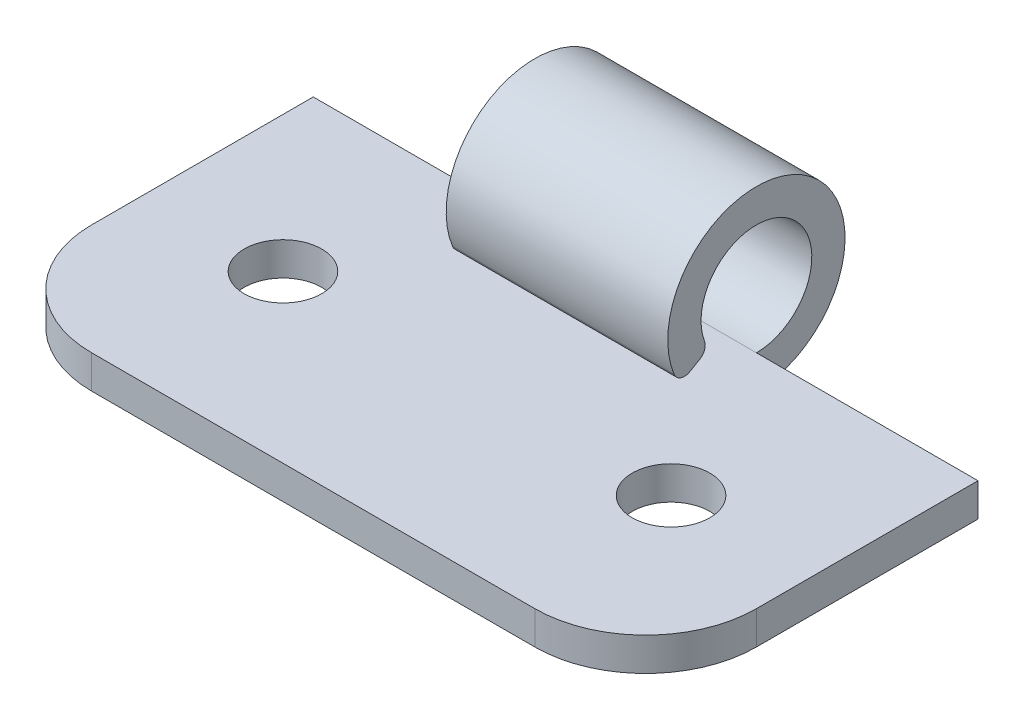
ISO-10303-21;
HEADER;
FILE_DESCRIPTION(('STEP AP214'),'2;1');
FILE_NAME('part.step','',(''),(''),'','','');
FILE_SCHEMA(('AUTOMOTIVE_DESIGN { 1 0 10303 214 1 1 1 1 }'));
ENDSEC;
DATA;
#1=APPLICATION_CONTEXT('core data for automotive mechanical design processes');
#2=APPLICATION_PROTOCOL_DEFINITION('international standard','automotive_design',2000,#1);
#3=PRODUCT_CONTEXT('',#1,'mechanical');
#4=PRODUCT('Part','Part','',(#3));
#5=PRODUCT_RELATED_PRODUCT_CATEGORY('part','',(#4));
#6=PRODUCT_DEFINITION_FORMATION('','',#4);
#7=PRODUCT_DEFINITION_CONTEXT('part definition',#1,'design');
#8=PRODUCT_DEFINITION('design','',#6,#7);
#9=PRODUCT_DEFINITION_SHAPE('','',#8);
#10=(LENGTH_UNIT() NAMED_UNIT(*) SI_UNIT(.MILLI.,.METRE.));
#11=(NAMED_UNIT(*) PLANE_ANGLE_UNIT() SI_UNIT($,.RADIAN.));
#12=(NAMED_UNIT(*) SI_UNIT($,.STERADIAN.) SOLID_ANGLE_UNIT());
#13=UNCERTAINTY_MEASURE_WITH_UNIT(LENGTH_MEASURE(1.E-05),#10,'distance_accuracy_value','');
#14=(GEOMETRIC_REPRESENTATION_CONTEXT(3) GLOBAL_UNCERTAINTY_ASSIGNED_CONTEXT((#13)) GLOBAL_UNIT_ASSIGNED_CONTEXT((#10,
#11,#12)) REPRESENTATION_CONTEXT('',''));
#15=CARTESIAN_POINT('',(0.,0.,0.));
#16=DIRECTION('',(0.,0.,1.));
#17=DIRECTION('',(1.,0.,0.));
#18=AXIS2_PLACEMENT_3D('',#15,#16,#17);
#19=CARTESIAN_POINT('',(-15.,1.5,-7.5));
#20=DIRECTION('',(0.,0.,1.));
#21=DIRECTION('',(1.,0.,0.));
#22=AXIS2_PLACEMENT_3D('',#19,#20,#21);
#23=PLANE('',#22);
#24=DIRECTION('',(0.,-1.,0.));
#25=VECTOR('',#24,1.);
#26=CARTESIAN_POINT('',(-5.,1.50000000000003,-7.49999999999998));
#27=LINE('',#26,#25);
#28=CARTESIAN_POINT('',(-5.,1.50000000000003,-7.49999999999998));
#29=VERTEX_POINT('',#28);
#30=CARTESIAN_POINT('',(-5.,0.,-7.5));
#31=VERTEX_POINT('',#30);
#32=EDGE_CURVE('E67',#29,#31,#27,.T.);
#33=ORIENTED_EDGE('',*,*,#32,.T.);
#34=DIRECTION('',(-1.,0.,0.));
#35=VECTOR('',#34,1.);
#36=CARTESIAN_POINT('',(-15.,0.,-7.5));
#37=LINE('',#36,#35);
#38=CARTESIAN_POINT('',(-15.,0.,-7.5));
#39=VERTEX_POINT('',#38);
#40=EDGE_CURVE('E202',#31,#39,#37,.T.);
#41=ORIENTED_EDGE('',*,*,#40,.T.);
#42=DIRECTION('',(0.,-1.,0.));
#43=VECTOR('',#42,1.);
#44=CARTESIAN_POINT('',(-15.,1.5,-7.5));
#45=LINE('',#44,#43);
#46=CARTESIAN_POINT('',(-15.,1.5,-7.5));
#47=VERTEX_POINT('',#46);
#48=EDGE_CURVE('E199',#47,#39,#45,.T.);
#49=ORIENTED_EDGE('',*,*,#48,.F.);
#50=DIRECTION('',(-1.,0.,0.));
#51=VECTOR('',#50,1.);
#52=CARTESIAN_POINT('',(-15.,1.5,-7.5));
#53=LINE('',#52,#51);
#54=EDGE_CURVE('E186',#29,#47,#53,.T.);
#55=ORIENTED_EDGE('',*,*,#54,.F.);
#56=EDGE_LOOP('',(#33,#41,#49,#55));
#57=FACE_BOUND('',#56,.T.);
#58=ADVANCED_FACE('F43',(#57),#23,.F.);
#59=CARTESIAN_POINT('',(0.,1.5,0.));
#60=DIRECTION('',(0.,-1.,0.));
#61=DIRECTION('',(0.,0.,-1.));
#62=AXIS2_PLACEMENT_3D('',#59,#60,#61);
#63=PLANE('',#62);
#64=DIRECTION('',(1.,0.,0.));
#65=VECTOR('',#64,1.);
#66=CARTESIAN_POINT('',(-15.,1.5,7.5));
#67=LINE('',#66,#65);
#68=CARTESIAN_POINT('',(-10.,1.5,7.5));
#69=VERTEX_POINT('',#68);
#70=CARTESIAN_POINT('',(10.,1.5,7.5));
#71=VERTEX_POINT('',#70);
#72=EDGE_CURVE('E195',#69,#71,#67,.T.);
#73=ORIENTED_EDGE('',*,*,#72,.T.);
#74=CARTESIAN_POINT('',(10.,1.5,2.5));
#75=DIRECTION('',(0.,-1.,0.));
#76=DIRECTION('',(0.,0.,-1.));
#77=AXIS2_PLACEMENT_3D('',#74,#75,#76);
#78=CIRCLE('',#77,5.);
#79=CARTESIAN_POINT('',(15.,1.5,2.5));
#80=VERTEX_POINT('',#79);
#81=EDGE_CURVE('E52',#71,#80,#78,.F.);
#82=ORIENTED_EDGE('',*,*,#81,.T.);
#83=DIRECTION('',(0.,0.,-1.));
#84=VECTOR('',#83,1.);
#85=CARTESIAN_POINT('',(15.,1.5,7.5));
#86=LINE('',#85,#84);
#87=CARTESIAN_POINT('',(15.,1.5,-7.5));
#88=VERTEX_POINT('',#87);
#89=EDGE_CURVE('E183',#80,#88,#86,.T.);
#90=ORIENTED_EDGE('',*,*,#89,.T.);
#91=CARTESIAN_POINT('',(5.,1.5,-7.5));
#92=VERTEX_POINT('',#91);
#93=EDGE_CURVE('E188',#88,#92,#53,.T.);
#94=ORIENTED_EDGE('',*,*,#93,.T.);
#95=DIRECTION('',(-1.,0.,0.));
#96=VECTOR('',#95,1.);
#97=CARTESIAN_POINT('',(5.,1.50000000000003,-7.49999999999998));
#98=LINE('',#97,#96);
#99=EDGE_CURVE('E274',#92,#29,#98,.T.);
#100=ORIENTED_EDGE('',*,*,#99,.T.);
#101=ORIENTED_EDGE('',*,*,#54,.T.);
#102=DIRECTION('',(0.,0.,1.));
#103=VECTOR('',#102,1.);
#104=CARTESIAN_POINT('',(-15.,1.5,7.5));
#105=LINE('',#104,#103);
#106=CARTESIAN_POINT('',(-15.,1.5,2.5));
#107=VERTEX_POINT('',#106);
#108=EDGE_CURVE('E191',#47,#107,#105,.T.);
#109=ORIENTED_EDGE('',*,*,#108,.T.);
#110=CARTESIAN_POINT('',(-10.,1.5,2.5));
#111=DIRECTION('',(0.,-1.,0.));
#112=DIRECTION('',(0.,0.,-1.));
#113=AXIS2_PLACEMENT_3D('',#110,#111,#112);
#114=CIRCLE('',#113,5.);
#115=EDGE_CURVE('E237',#107,#69,#114,.F.);
#116=ORIENTED_EDGE('',*,*,#115,.T.);
#117=EDGE_LOOP('',(#73,#82,#90,#94,#100,#101,#109,#116));
#118=FACE_BOUND('',#117,.T.);
#119=CARTESIAN_POINT('',(-8.86733098836335,1.5,0.));
#120=DIRECTION('',(0.,1.,0.));
#121=DIRECTION('',(0.,0.,1.));
#122=AXIS2_PLACEMENT_3D('',#119,#120,#121);
#123=CIRCLE('',#122,1.75);
#124=CARTESIAN_POINT('',(-8.86733098836335,1.5,1.75));
#125=VERTEX_POINT('',#124);
#126=EDGE_CURVE('E175',#125,#125,#123,.T.);
#127=ORIENTED_EDGE('',*,*,#126,.F.);
#128=EDGE_LOOP('',(#127));
#129=FACE_BOUND('',#128,.T.);
#130=CARTESIAN_POINT('',(8.64739718707361,1.5,0.));
#131=DIRECTION('',(0.,1.,0.));
#132=DIRECTION('',(0.,0.,1.));
#133=AXIS2_PLACEMENT_3D('',#130,#131,#132);
#134=CIRCLE('',#133,1.75);
#135=CARTESIAN_POINT('',(8.64739718707361,1.5,1.75));
#136=VERTEX_POINT('',#135);
#137=EDGE_CURVE('E165',#136,#136,#134,.T.);
#138=ORIENTED_EDGE('',*,*,#137,.F.);
#139=EDGE_LOOP('',(#138));
#140=FACE_BOUND('',#139,.T.);
#141=ADVANCED_FACE('F243',(#118,#129,#140),#63,.F.);
#142=CARTESIAN_POINT('',(0.,0.,0.));
#143=DIRECTION('',(0.,-1.,0.));
#144=DIRECTION('',(0.,0.,-1.));
#145=AXIS2_PLACEMENT_3D('',#142,#143,#144);
#146=PLANE('',#145);
#147=CARTESIAN_POINT('',(-8.86733098836335,0.,0.));
#148=DIRECTION('',(0.,1.,0.));
#149=DIRECTION('',(0.,0.,1.));
#150=AXIS2_PLACEMENT_3D('',#147,#148,#149);
#151=CIRCLE('',#150,1.75);
#152=CARTESIAN_POINT('',(-8.86733098836335,0.,1.75));
#153=VERTEX_POINT('',#152);
#154=EDGE_CURVE('E173',#153,#153,#151,.T.);
#155=ORIENTED_EDGE('',*,*,#154,.T.);
#156=EDGE_LOOP('',(#155));
#157=FACE_BOUND('',#156,.T.);
#158=DIRECTION('',(0.,0.,-1.));
#159=VECTOR('',#158,1.);
#160=CARTESIAN_POINT('',(15.,0.,7.5));
#161=LINE('',#160,#159);
#162=CARTESIAN_POINT('',(15.,0.,2.5));
#163=VERTEX_POINT('',#162);
#164=CARTESIAN_POINT('',(15.,0.,-7.5));
#165=VERTEX_POINT('',#164);
#166=EDGE_CURVE('E179',#163,#165,#161,.T.);
#167=ORIENTED_EDGE('',*,*,#166,.F.);
#168=CARTESIAN_POINT('',(10.,0.,2.5));
#169=DIRECTION('',(0.,-1.,0.));
#170=DIRECTION('',(0.,0.,-1.));
#171=AXIS2_PLACEMENT_3D('',#168,#169,#170);
#172=CIRCLE('',#171,5.);
#173=CARTESIAN_POINT('',(10.,0.,7.5));
#174=VERTEX_POINT('',#173);
#175=EDGE_CURVE('E227',#163,#174,#172,.T.);
#176=ORIENTED_EDGE('',*,*,#175,.T.);
#177=DIRECTION('',(1.,0.,0.));
#178=VECTOR('',#177,1.);
#179=CARTESIAN_POINT('',(-15.,0.,7.5));
#180=LINE('',#179,#178);
#181=CARTESIAN_POINT('',(-10.,0.,7.5));
#182=VERTEX_POINT('',#181);
#183=EDGE_CURVE('E187',#182,#174,#180,.T.);
#184=ORIENTED_EDGE('',*,*,#183,.F.);
#185=CARTESIAN_POINT('',(-10.,0.,2.5));
#186=DIRECTION('',(0.,-1.,0.));
#187=DIRECTION('',(0.,0.,-1.));
#188=AXIS2_PLACEMENT_3D('',#185,#186,#187);
#189=CIRCLE('',#188,5.);
#190=CARTESIAN_POINT('',(-15.,0.,2.5));
#191=VERTEX_POINT('',#190);
#192=EDGE_CURVE('E224',#182,#191,#189,.T.);
#193=ORIENTED_EDGE('',*,*,#192,.T.);
#194=DIRECTION('',(0.,0.,1.));
#195=VECTOR('',#194,1.);
#196=CARTESIAN_POINT('',(-15.,0.,7.5));
#197=LINE('',#196,#195);
#198=EDGE_CURVE('E206',#39,#191,#197,.T.);
#199=ORIENTED_EDGE('',*,*,#198,.F.);
#200=ORIENTED_EDGE('',*,*,#40,.F.);
#201=DIRECTION('',(-1.,0.,0.));
#202=VECTOR('',#201,1.);
#203=CARTESIAN_POINT('',(5.,0.,-7.5));
#204=LINE('',#203,#202);
#205=CARTESIAN_POINT('',(5.,0.,-7.5));
#206=VERTEX_POINT('',#205);
#207=EDGE_CURVE('E279',#206,#31,#204,.T.);
#208=ORIENTED_EDGE('',*,*,#207,.F.);
#209=EDGE_CURVE('E203',#165,#206,#37,.T.);
#210=ORIENTED_EDGE('',*,*,#209,.F.);
#211=EDGE_LOOP('',(#167,#176,#184,#193,#199,#200,#208,#210));
#212=FACE_BOUND('',#211,.T.);
#213=CARTESIAN_POINT('',(8.64739718707361,0.,0.));
#214=DIRECTION('',(0.,1.,0.));
#215=DIRECTION('',(0.,0.,1.));
#216=AXIS2_PLACEMENT_3D('',#213,#214,#215);
#217=CIRCLE('',#216,1.75);
#218=CARTESIAN_POINT('',(8.64739718707361,0.,1.75));
#219=VERTEX_POINT('',#218);
#220=EDGE_CURVE('E160',#219,#219,#217,.T.);
#221=ORIENTED_EDGE('',*,*,#220,.T.);
#222=EDGE_LOOP('',(#221));
#223=FACE_BOUND('',#222,.T.);
#224=ADVANCED_FACE('F256',(#157,#212,#223),#146,.T.);
#225=CARTESIAN_POINT('',(15.,1.5,7.5));
#226=DIRECTION('',(-1.,0.,0.));
#227=DIRECTION('',(0.,0.,1.));
#228=AXIS2_PLACEMENT_3D('',#225,#226,#227);
#229=PLANE('',#228);
#230=ORIENTED_EDGE('',*,*,#89,.F.);
#231=DIRECTION('',(0.,-1.,0.));
#232=VECTOR('',#231,1.);
#233=CARTESIAN_POINT('',(15.,1.5,2.5));
#234=LINE('',#233,#232);
#235=EDGE_CURVE('E220',#80,#163,#234,.T.);
#236=ORIENTED_EDGE('',*,*,#235,.T.);
#237=ORIENTED_EDGE('',*,*,#166,.T.);
#238=DIRECTION('',(0.,-1.,0.));
#239=VECTOR('',#238,1.);
#240=CARTESIAN_POINT('',(15.,1.5,-7.5));
#241=LINE('',#240,#239);
#242=EDGE_CURVE('E216',#88,#165,#241,.T.);
#243=ORIENTED_EDGE('',*,*,#242,.F.);
#244=EDGE_LOOP('',(#230,#236,#237,#243));
#245=FACE_BOUND('',#244,.T.);
#246=ADVANCED_FACE('F251',(#245),#229,.F.);
#247=ORIENTED_EDGE('',*,*,#209,.T.);
#248=DIRECTION('',(0.,-1.,0.));
#249=VECTOR('',#248,1.);
#250=CARTESIAN_POINT('',(5.,1.50000000000003,-7.49999999999998));
#251=LINE('',#250,#249);
#252=EDGE_CURVE('E59',#92,#206,#251,.T.);
#253=ORIENTED_EDGE('',*,*,#252,.F.);
#254=ORIENTED_EDGE('',*,*,#93,.F.);
#255=ORIENTED_EDGE('',*,*,#242,.T.);
#256=EDGE_LOOP('',(#247,#253,#254,#255));
#257=FACE_BOUND('',#256,.T.);
#258=ADVANCED_FACE('F338',(#257),#23,.F.);
#259=CARTESIAN_POINT('',(-15.,1.5,7.5));
#260=DIRECTION('',(1.,0.,0.));
#261=DIRECTION('',(0.,0.,-1.));
#262=AXIS2_PLACEMENT_3D('',#259,#260,#261);
#263=PLANE('',#262);
#264=ORIENTED_EDGE('',*,*,#198,.T.);
#265=DIRECTION('',(0.,-1.,0.));
#266=VECTOR('',#265,1.);
#267=CARTESIAN_POINT('',(-15.,1.5,2.5));
#268=LINE('',#267,#266);
#269=EDGE_CURVE('E11',#191,#107,#268,.F.);
#270=ORIENTED_EDGE('',*,*,#269,.T.);
#271=ORIENTED_EDGE('',*,*,#108,.F.);
#272=ORIENTED_EDGE('',*,*,#48,.T.);
#273=EDGE_LOOP('',(#264,#270,#271,#272));
#274=FACE_BOUND('',#273,.T.);
#275=ADVANCED_FACE('F267',(#274),#263,.F.);
#276=CARTESIAN_POINT('',(-15.,1.5,7.5));
#277=DIRECTION('',(0.,0.,-1.));
#278=DIRECTION('',(-1.,0.,0.));
#279=AXIS2_PLACEMENT_3D('',#276,#277,#278);
#280=PLANE('',#279);
#281=ORIENTED_EDGE('',*,*,#183,.T.);
#282=DIRECTION('',(0.,-1.,0.));
#283=VECTOR('',#282,1.);
#284=CARTESIAN_POINT('',(10.,1.5,7.5));
#285=LINE('',#284,#283);
#286=EDGE_CURVE('E234',#174,#71,#285,.F.);
#287=ORIENTED_EDGE('',*,*,#286,.T.);
#288=ORIENTED_EDGE('',*,*,#72,.F.);
#289=DIRECTION('',(0.,-1.,0.));
#290=VECTOR('',#289,1.);
#291=CARTESIAN_POINT('',(-10.,1.5,7.5));
#292=LINE('',#291,#290);
#293=EDGE_CURVE('E230',#69,#182,#292,.T.);
#294=ORIENTED_EDGE('',*,*,#293,.T.);
#295=EDGE_LOOP('',(#281,#287,#288,#294));
#296=FACE_BOUND('',#295,.T.);
#297=ADVANCED_FACE('F260',(#296),#280,.F.);
#298=CARTESIAN_POINT('',(-8.86733098836335,1.5,0.));
#299=DIRECTION('',(0.,-1.,0.));
#300=DIRECTION('',(0.,0.,-1.));
#301=AXIS2_PLACEMENT_3D('',#298,#299,#300);
#302=CYLINDRICAL_SURFACE('',#301,1.75);
#303=ORIENTED_EDGE('',*,*,#126,.T.);
#304=EDGE_LOOP('',(#303));
#305=FACE_BOUND('',#304,.T.);
#306=ORIENTED_EDGE('',*,*,#154,.F.);
#307=EDGE_LOOP('',(#306));
#308=FACE_BOUND('',#307,.T.);
#309=ADVANCED_FACE('F361',(#305,#308),#302,.F.);
#310=CARTESIAN_POINT('',(8.64739718707361,1.5,0.));
#311=DIRECTION('',(0.,-1.,0.));
#312=DIRECTION('',(0.,0.,-1.));
#313=AXIS2_PLACEMENT_3D('',#310,#311,#312);
#314=CYLINDRICAL_SURFACE('',#313,1.75);
#315=ORIENTED_EDGE('',*,*,#137,.T.);
#316=EDGE_LOOP('',(#315));
#317=FACE_BOUND('',#316,.T.);
#318=ORIENTED_EDGE('',*,*,#220,.F.);
#319=EDGE_LOOP('',(#318));
#320=FACE_BOUND('',#319,.T.);
#321=ADVANCED_FACE('F356',(#317,#320),#314,.F.);
#322=CARTESIAN_POINT('',(10.,1.5,2.5));
#323=DIRECTION('',(0.,-1.,0.));
#324=DIRECTION('',(0.,0.,-1.));
#325=AXIS2_PLACEMENT_3D('',#322,#323,#324);
#326=CYLINDRICAL_SURFACE('',#325,5.);
#327=ORIENTED_EDGE('',*,*,#81,.F.);
#328=ORIENTED_EDGE('',*,*,#286,.F.);
#329=ORIENTED_EDGE('',*,*,#175,.F.);
#330=ORIENTED_EDGE('',*,*,#235,.F.);
#331=EDGE_LOOP('',(#327,#328,#329,#330));
#332=FACE_BOUND('',#331,.T.);
#333=ADVANCED_FACE('F253',(#332),#326,.T.);
#334=CARTESIAN_POINT('',(-10.,1.5,2.5));
#335=DIRECTION('',(0.,-1.,0.));
#336=DIRECTION('',(0.,0.,-1.));
#337=AXIS2_PLACEMENT_3D('',#334,#335,#336);
#338=CYLINDRICAL_SURFACE('',#337,5.);
#339=ORIENTED_EDGE('',*,*,#115,.F.);
#340=ORIENTED_EDGE('',*,*,#269,.F.);
#341=ORIENTED_EDGE('',*,*,#192,.F.);
#342=ORIENTED_EDGE('',*,*,#293,.F.);
#343=EDGE_LOOP('',(#339,#340,#341,#342));
#344=FACE_BOUND('',#343,.T.);
#345=ADVANCED_FACE('F45',(#344),#338,.T.);
#346=CARTESIAN_POINT('',(5.,4.00000000000003,-7.49999999999996));
#347=DIRECTION('',(-1.,0.,0.));
#348=DIRECTION('',(0.,0.,1.));
#349=AXIS2_PLACEMENT_3D('',#346,#347,#348);
#350=CYLINDRICAL_SURFACE('',#349,4.00000000000002);
#351=CARTESIAN_POINT('',(-5.,4.00000000000003,-7.49999999999996));
#352=DIRECTION('',(1.,0.,0.));
#353=DIRECTION('',(0.,0.,-1.));
#354=AXIS2_PLACEMENT_3D('',#351,#352,#353);
#355=CIRCLE('',#354,4.00000000000002);
#356=CARTESIAN_POINT('',(-5.,2.51538502208382,-3.78571428571424));
#357=VERTEX_POINT('',#356);
#358=EDGE_CURVE('E158',#31,#357,#355,.T.);
#359=ORIENTED_EDGE('',*,*,#358,.T.);
#360=DIRECTION('',(-1.,0.,0.));
#361=VECTOR('',#360,1.);
#362=CARTESIAN_POINT('',(5.,2.51538502208382,-3.78571428571424));
#363=LINE('',#362,#361);
#364=CARTESIAN_POINT('',(5.,2.51538502208382,-3.78571428571424));
#365=VERTEX_POINT('',#364);
#366=EDGE_CURVE('E139',#365,#357,#363,.T.);
#367=ORIENTED_EDGE('',*,*,#366,.F.);
#368=CARTESIAN_POINT('',(5.,4.00000000000003,-7.49999999999996));
#369=DIRECTION('',(1.,0.,0.));
#370=DIRECTION('',(0.,0.,-1.));
#371=AXIS2_PLACEMENT_3D('',#368,#369,#370);
#372=CIRCLE('',#371,4.00000000000002);
#373=EDGE_CURVE('E147',#206,#365,#372,.T.);
#374=ORIENTED_EDGE('',*,*,#373,.F.);
#375=ORIENTED_EDGE('',*,*,#207,.T.);
#376=EDGE_LOOP('',(#359,#367,#374,#375));
#377=FACE_BOUND('',#376,.T.);
#378=ADVANCED_FACE('F156',(#377),#350,.T.);
#379=CARTESIAN_POINT('',(5.,2.70096189432335,-4.24999999999997));
#380=DIRECTION('',(-1.,0.,0.));
#381=DIRECTION('',(0.,0.,1.));
#382=AXIS2_PLACEMENT_3D('',#379,#380,#381);
#383=CYLINDRICAL_SURFACE('',#382,0.500000000000015);
#384=CARTESIAN_POINT('',(-5.,2.70096189432335,-4.24999999999997));
#385=DIRECTION('',(1.,0.,0.));
#386=DIRECTION('',(0.,0.,1.));
#387=AXIS2_PLACEMENT_3D('',#384,#385,#386);
#388=CIRCLE('',#387,0.500000000000015);
#389=CARTESIAN_POINT('',(-5.,2.26794919243112,-4.49999999999994));
#390=VERTEX_POINT('',#389);
#391=EDGE_CURVE('E309',#357,#390,#388,.T.);
#392=ORIENTED_EDGE('',*,*,#391,.T.);
#393=DIRECTION('',(-1.,0.,0.));
#394=VECTOR('',#393,1.);
#395=CARTESIAN_POINT('',(5.,2.26794919243112,-4.49999999999994));
#396=LINE('',#395,#394);
#397=CARTESIAN_POINT('',(5.,2.26794919243112,-4.49999999999994));
#398=VERTEX_POINT('',#397);
#399=EDGE_CURVE('E142',#398,#390,#396,.T.);
#400=ORIENTED_EDGE('',*,*,#399,.F.);
#401=CARTESIAN_POINT('',(5.,2.70096189432335,-4.24999999999997));
#402=DIRECTION('',(1.,0.,0.));
#403=DIRECTION('',(0.,0.,1.));
#404=AXIS2_PLACEMENT_3D('',#401,#402,#403);
#405=CIRCLE('',#404,0.500000000000015);
#406=EDGE_CURVE('E135',#365,#398,#405,.T.);
#407=ORIENTED_EDGE('',*,*,#406,.F.);
#408=ORIENTED_EDGE('',*,*,#366,.T.);
#409=EDGE_LOOP('',(#392,#400,#407,#408));
#410=FACE_BOUND('',#409,.T.);
#411=ADVANCED_FACE('F137',(#410),#383,.T.);
#412=CARTESIAN_POINT('',(5.,2.52098005422511,-4.93826230851007));
#413=DIRECTION('',(0.,0.866025403784437,0.500000000000003));
#414=DIRECTION('',(0.,-0.500000000000003,0.866025403784437));
#415=AXIS2_PLACEMENT_3D('',#412,#413,#414);
#416=PLANE('',#415);
#417=DIRECTION('',(0.,0.500000000000003,-0.866025403784437));
#418=VECTOR('',#417,1.);
#419=CARTESIAN_POINT('',(-5.,2.52098005422511,-4.93826230851007));
#420=LINE('',#419,#418);
#421=CARTESIAN_POINT('',(-5.,2.52098005422511,-4.93826230851007));
#422=VERTEX_POINT('',#421);
#423=EDGE_CURVE('E302',#390,#422,#420,.T.);
#424=ORIENTED_EDGE('',*,*,#423,.T.);
#425=DIRECTION('',(-1.,0.,0.));
#426=VECTOR('',#425,1.);
#427=CARTESIAN_POINT('',(5.,2.52098005422511,-4.93826230851007));
#428=LINE('',#427,#426);
#429=CARTESIAN_POINT('',(5.,2.52098005422511,-4.93826230851007));
#430=VERTEX_POINT('',#429);
#431=EDGE_CURVE('E167',#430,#422,#428,.T.);
#432=ORIENTED_EDGE('',*,*,#431,.F.);
#433=DIRECTION('',(0.,0.500000000000003,-0.866025403784437));
#434=VECTOR('',#433,1.);
#435=CARTESIAN_POINT('',(5.,2.52098005422511,-4.93826230851007));
#436=LINE('',#435,#434);
#437=EDGE_CURVE('E146',#398,#430,#436,.T.);
#438=ORIENTED_EDGE('',*,*,#437,.F.);
#439=ORIENTED_EDGE('',*,*,#399,.T.);
#440=EDGE_LOOP('',(#424,#432,#438,#439));
#441=FACE_BOUND('',#440,.T.);
#442=ADVANCED_FACE('F325',(#441),#416,.F.);
#443=CARTESIAN_POINT('',(5.,2.95399275611733,-4.68826230851006));
#444=DIRECTION('',(-1.,0.,0.));
#445=DIRECTION('',(0.,0.,1.));
#446=AXIS2_PLACEMENT_3D('',#443,#444,#445);
#447=CYLINDRICAL_SURFACE('',#446,0.5);
#448=CARTESIAN_POINT('',(-5.,2.95399275611733,-4.68826230851006));
#449=DIRECTION('',(1.,0.,0.));
#450=DIRECTION('',(0.,0.,1.));
#451=AXIS2_PLACEMENT_3D('',#448,#449,#450);
#452=CIRCLE('',#451,0.5);
#453=CARTESIAN_POINT('',(-5.,3.12832729676445,-5.15688525709171));
#454=VERTEX_POINT('',#453);
#455=EDGE_CURVE('E295',#422,#454,#452,.T.);
#456=ORIENTED_EDGE('',*,*,#455,.T.);
#457=DIRECTION('',(-1.,0.,0.));
#458=VECTOR('',#457,1.);
#459=CARTESIAN_POINT('',(5.,3.12832729676445,-5.15688525709171));
#460=LINE('',#459,#458);
#461=CARTESIAN_POINT('',(5.,3.12832729676445,-5.15688525709171));
#462=VERTEX_POINT('',#461);
#463=EDGE_CURVE('E278',#462,#454,#460,.T.);
#464=ORIENTED_EDGE('',*,*,#463,.F.);
#465=CARTESIAN_POINT('',(5.,2.95399275611733,-4.68826230851006));
#466=DIRECTION('',(1.,0.,0.));
#467=DIRECTION('',(0.,0.,1.));
#468=AXIS2_PLACEMENT_3D('',#465,#466,#467);
#469=CIRCLE('',#468,0.5);
#470=EDGE_CURVE('E296',#430,#462,#469,.T.);
#471=ORIENTED_EDGE('',*,*,#470,.F.);
#472=ORIENTED_EDGE('',*,*,#431,.T.);
#473=EDGE_LOOP('',(#456,#464,#471,#472));
#474=FACE_BOUND('',#473,.T.);
#475=ADVANCED_FACE('F293',(#474),#447,.T.);
#476=CARTESIAN_POINT('',(5.,4.00000000000003,-7.49999999999996));
#477=DIRECTION('',(-1.,0.,0.));
#478=DIRECTION('',(0.,0.,1.));
#479=AXIS2_PLACEMENT_3D('',#476,#477,#478);
#480=CYLINDRICAL_SURFACE('',#479,2.5);
#481=CARTESIAN_POINT('',(-5.,4.00000000000003,-7.49999999999996));
#482=DIRECTION('',(-1.,0.,0.));
#483=DIRECTION('',(0.,0.,-1.));
#484=AXIS2_PLACEMENT_3D('',#481,#482,#483);
#485=CIRCLE('',#484,2.5);
#486=EDGE_CURVE('E303',#454,#29,#485,.T.);
#487=ORIENTED_EDGE('',*,*,#486,.T.);
#488=ORIENTED_EDGE('',*,*,#99,.F.);
#489=CARTESIAN_POINT('',(5.,4.00000000000003,-7.49999999999996));
#490=DIRECTION('',(-1.,0.,0.));
#491=DIRECTION('',(0.,0.,-1.));
#492=AXIS2_PLACEMENT_3D('',#489,#490,#491);
#493=CIRCLE('',#492,2.5);
#494=EDGE_CURVE('E317',#462,#92,#493,.T.);
#495=ORIENTED_EDGE('',*,*,#494,.F.);
#496=ORIENTED_EDGE('',*,*,#463,.T.);
#497=EDGE_LOOP('',(#487,#488,#495,#496));
#498=FACE_BOUND('',#497,.T.);
#499=ADVANCED_FACE('F326',(#498),#480,.F.);
#500=CARTESIAN_POINT('',(5.,4.00000000000003,-7.49999999999996));
#501=DIRECTION('',(1.,0.,0.));
#502=DIRECTION('',(0.,0.,-1.));
#503=AXIS2_PLACEMENT_3D('',#500,#501,#502);
#504=PLANE('',#503);
#505=ORIENTED_EDGE('',*,*,#373,.T.);
#506=ORIENTED_EDGE('',*,*,#406,.T.);
#507=ORIENTED_EDGE('',*,*,#437,.T.);
#508=ORIENTED_EDGE('',*,*,#470,.T.);
#509=ORIENTED_EDGE('',*,*,#494,.T.);
#510=ORIENTED_EDGE('',*,*,#252,.T.);
#511=EDGE_LOOP('',(#505,#506,#507,#508,#509,#510));
#512=FACE_BOUND('',#511,.T.);
#513=ADVANCED_FACE('F150',(#512),#504,.T.);
#514=CARTESIAN_POINT('',(-5.,4.00000000000003,-7.49999999999996));
#515=DIRECTION('',(1.,0.,0.));
#516=DIRECTION('',(0.,0.,-1.));
#517=AXIS2_PLACEMENT_3D('',#514,#515,#516);
#518=PLANE('',#517);
#519=ORIENTED_EDGE('',*,*,#358,.F.);
#520=ORIENTED_EDGE('',*,*,#32,.F.);
#521=ORIENTED_EDGE('',*,*,#486,.F.);
#522=ORIENTED_EDGE('',*,*,#455,.F.);
#523=ORIENTED_EDGE('',*,*,#423,.F.);
#524=ORIENTED_EDGE('',*,*,#391,.F.);
#525=EDGE_LOOP('',(#519,#520,#521,#522,#523,#524));
#526=FACE_BOUND('',#525,.T.);
#527=ADVANCED_FACE('F301',(#526),#518,.F.);
#528=CLOSED_SHELL('',(#58,#141,#224,#246,#258,#275,#297,#309,#321,#333,#345,#378,#411,#442,#475,
#499,#513,#527));
#529=MANIFOLD_SOLID_BREP('B2',#528);
#530=ADVANCED_BREP_SHAPE_REPRESENTATION('',(#18,#529),#14);
#531=SHAPE_DEFINITION_REPRESENTATION(#9,#530);
ENDSEC;
END-ISO-10303-21;
